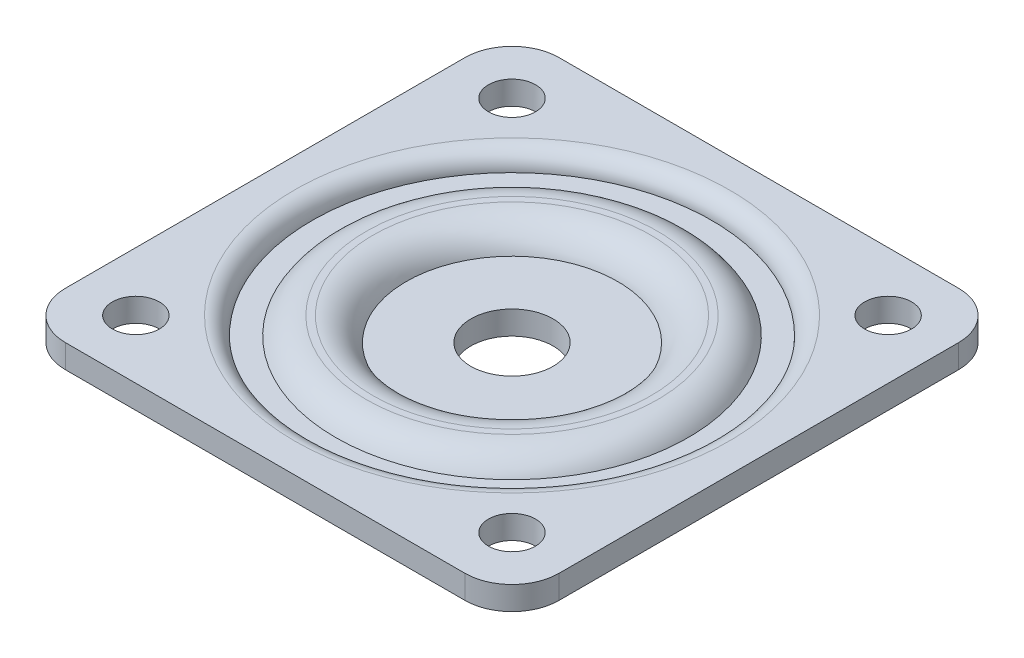
ISO-10303-21;
HEADER;
FILE_DESCRIPTION(('STEP AP214'),'2;1');
FILE_NAME('part.step','',(''),(''),'','','');
FILE_SCHEMA(('AUTOMOTIVE_DESIGN { 1 0 10303 214 1 1 1 1 }'));
ENDSEC;
DATA;
#1=APPLICATION_CONTEXT('core data for automotive mechanical design processes');
#2=APPLICATION_PROTOCOL_DEFINITION('international standard','automotive_design',2000,#1);
#3=PRODUCT_CONTEXT('',#1,'mechanical');
#4=PRODUCT('Part','Part','',(#3));
#5=PRODUCT_RELATED_PRODUCT_CATEGORY('part','',(#4));
#6=PRODUCT_DEFINITION_FORMATION('','',#4);
#7=PRODUCT_DEFINITION_CONTEXT('part definition',#1,'design');
#8=PRODUCT_DEFINITION('design','',#6,#7);
#9=PRODUCT_DEFINITION_SHAPE('','',#8);
#10=(LENGTH_UNIT() NAMED_UNIT(*) SI_UNIT(.MILLI.,.METRE.));
#11=(NAMED_UNIT(*) PLANE_ANGLE_UNIT() SI_UNIT($,.RADIAN.));
#12=(NAMED_UNIT(*) SI_UNIT($,.STERADIAN.) SOLID_ANGLE_UNIT());
#13=UNCERTAINTY_MEASURE_WITH_UNIT(LENGTH_MEASURE(1.E-05),#10,'distance_accuracy_value','');
#14=(GEOMETRIC_REPRESENTATION_CONTEXT(3) GLOBAL_UNCERTAINTY_ASSIGNED_CONTEXT((#13)) GLOBAL_UNIT_ASSIGNED_CONTEXT((#10,
#11,#12)) REPRESENTATION_CONTEXT('',''));
#15=CARTESIAN_POINT('',(0.,0.,0.));
#16=DIRECTION('',(0.,0.,1.));
#17=DIRECTION('',(1.,0.,0.));
#18=AXIS2_PLACEMENT_3D('',#15,#16,#17);
#19=CARTESIAN_POINT('',(-21.,4.,21.));
#20=DIRECTION('',(1.,0.,0.));
#21=DIRECTION('',(0.,0.,-1.));
#22=AXIS2_PLACEMENT_3D('',#19,#20,#21);
#23=PLANE('',#22);
#24=DIRECTION('',(0.,0.,1.));
#25=VECTOR('',#24,1.);
#26=CARTESIAN_POINT('',(-21.,4.,21.));
#27=LINE('',#26,#25);
#28=CARTESIAN_POINT('',(-21.,4.,-17.));
#29=VERTEX_POINT('',#28);
#30=CARTESIAN_POINT('',(-21.,4.,17.));
#31=VERTEX_POINT('',#30);
#32=EDGE_CURVE('E156',#29,#31,#27,.T.);
#33=ORIENTED_EDGE('',*,*,#32,.F.);
#34=DIRECTION('',(0.,-1.,0.));
#35=VECTOR('',#34,1.);
#36=CARTESIAN_POINT('',(-21.,4.,-17.));
#37=LINE('',#36,#35);
#38=CARTESIAN_POINT('',(-21.,2.,-17.));
#39=VERTEX_POINT('',#38);
#40=EDGE_CURVE('E109',#29,#39,#37,.T.);
#41=ORIENTED_EDGE('',*,*,#40,.T.);
#42=DIRECTION('',(0.,0.,-1.));
#43=VECTOR('',#42,1.);
#44=CARTESIAN_POINT('',(-21.,2.,0.));
#45=LINE('',#44,#43);
#46=CARTESIAN_POINT('',(-21.,2.,17.));
#47=VERTEX_POINT('',#46);
#48=EDGE_CURVE('E101',#47,#39,#45,.T.);
#49=ORIENTED_EDGE('',*,*,#48,.F.);
#50=DIRECTION('',(0.,-1.,0.));
#51=VECTOR('',#50,1.);
#52=CARTESIAN_POINT('',(-21.,4.,17.));
#53=LINE('',#52,#51);
#54=EDGE_CURVE('E114',#47,#31,#53,.F.);
#55=ORIENTED_EDGE('',*,*,#54,.T.);
#56=EDGE_LOOP('',(#33,#41,#49,#55));
#57=FACE_BOUND('',#56,.T.);
#58=ADVANCED_FACE('F32',(#57),#23,.F.);
#59=CARTESIAN_POINT('',(21.,4.,21.));
#60=DIRECTION('',(0.,0.,-1.));
#61=DIRECTION('',(-1.,0.,0.));
#62=AXIS2_PLACEMENT_3D('',#59,#60,#61);
#63=PLANE('',#62);
#64=DIRECTION('',(-1.,0.,0.));
#65=VECTOR('',#64,1.);
#66=CARTESIAN_POINT('',(0.,2.,21.));
#67=LINE('',#66,#65);
#68=CARTESIAN_POINT('',(17.,2.,21.));
#69=VERTEX_POINT('',#68);
#70=CARTESIAN_POINT('',(-17.,2.,21.));
#71=VERTEX_POINT('',#70);
#72=EDGE_CURVE('E103',#69,#71,#67,.T.);
#73=ORIENTED_EDGE('',*,*,#72,.F.);
#74=DIRECTION('',(0.,-1.,0.));
#75=VECTOR('',#74,1.);
#76=CARTESIAN_POINT('',(17.,4.,21.));
#77=LINE('',#76,#75);
#78=CARTESIAN_POINT('',(17.,4.,21.));
#79=VERTEX_POINT('',#78);
#80=EDGE_CURVE('E11',#69,#79,#77,.F.);
#81=ORIENTED_EDGE('',*,*,#80,.T.);
#82=DIRECTION('',(1.,0.,0.));
#83=VECTOR('',#82,1.);
#84=CARTESIAN_POINT('',(21.,4.,21.));
#85=LINE('',#84,#83);
#86=CARTESIAN_POINT('',(-17.,4.,21.));
#87=VERTEX_POINT('',#86);
#88=EDGE_CURVE('E154',#87,#79,#85,.T.);
#89=ORIENTED_EDGE('',*,*,#88,.F.);
#90=DIRECTION('',(0.,-1.,0.));
#91=VECTOR('',#90,1.);
#92=CARTESIAN_POINT('',(-17.,4.,21.));
#93=LINE('',#92,#91);
#94=EDGE_CURVE('E40',#87,#71,#93,.T.);
#95=ORIENTED_EDGE('',*,*,#94,.T.);
#96=EDGE_LOOP('',(#73,#81,#89,#95));
#97=FACE_BOUND('',#96,.T.);
#98=ADVANCED_FACE('F152',(#97),#63,.F.);
#99=CARTESIAN_POINT('',(21.,4.,21.));
#100=DIRECTION('',(-1.,0.,0.));
#101=DIRECTION('',(0.,0.,1.));
#102=AXIS2_PLACEMENT_3D('',#99,#100,#101);
#103=PLANE('',#102);
#104=DIRECTION('',(0.,0.,1.));
#105=VECTOR('',#104,1.);
#106=CARTESIAN_POINT('',(21.,2.,0.));
#107=LINE('',#106,#105);
#108=CARTESIAN_POINT('',(21.,2.,-17.));
#109=VERTEX_POINT('',#108);
#110=CARTESIAN_POINT('',(21.,2.,17.));
#111=VERTEX_POINT('',#110);
#112=EDGE_CURVE('E225',#109,#111,#107,.T.);
#113=ORIENTED_EDGE('',*,*,#112,.F.);
#114=DIRECTION('',(0.,-1.,0.));
#115=VECTOR('',#114,1.);
#116=CARTESIAN_POINT('',(21.,4.,-17.));
#117=LINE('',#116,#115);
#118=CARTESIAN_POINT('',(21.,4.,-17.));
#119=VERTEX_POINT('',#118);
#120=EDGE_CURVE('E47',#109,#119,#117,.F.);
#121=ORIENTED_EDGE('',*,*,#120,.T.);
#122=DIRECTION('',(0.,0.,-1.));
#123=VECTOR('',#122,1.);
#124=CARTESIAN_POINT('',(21.,4.,21.));
#125=LINE('',#124,#123);
#126=CARTESIAN_POINT('',(21.,4.,17.));
#127=VERTEX_POINT('',#126);
#128=EDGE_CURVE('E155',#127,#119,#125,.T.);
#129=ORIENTED_EDGE('',*,*,#128,.F.);
#130=DIRECTION('',(0.,-1.,0.));
#131=VECTOR('',#130,1.);
#132=CARTESIAN_POINT('',(21.,4.,17.));
#133=LINE('',#132,#131);
#134=EDGE_CURVE('E147',#127,#111,#133,.T.);
#135=ORIENTED_EDGE('',*,*,#134,.T.);
#136=EDGE_LOOP('',(#113,#121,#129,#135));
#137=FACE_BOUND('',#136,.T.);
#138=ADVANCED_FACE('F257',(#137),#103,.F.);
#139=CARTESIAN_POINT('',(21.,4.,-21.));
#140=DIRECTION('',(0.,0.,1.));
#141=DIRECTION('',(1.,0.,0.));
#142=AXIS2_PLACEMENT_3D('',#139,#140,#141);
#143=PLANE('',#142);
#144=DIRECTION('',(1.,0.,0.));
#145=VECTOR('',#144,1.);
#146=CARTESIAN_POINT('',(0.,2.,-21.));
#147=LINE('',#146,#145);
#148=CARTESIAN_POINT('',(-17.,2.,-21.));
#149=VERTEX_POINT('',#148);
#150=CARTESIAN_POINT('',(17.,2.,-21.));
#151=VERTEX_POINT('',#150);
#152=EDGE_CURVE('E117',#149,#151,#147,.T.);
#153=ORIENTED_EDGE('',*,*,#152,.F.);
#154=DIRECTION('',(0.,-1.,0.));
#155=VECTOR('',#154,1.);
#156=CARTESIAN_POINT('',(-17.,4.,-21.));
#157=LINE('',#156,#155);
#158=CARTESIAN_POINT('',(-17.,4.,-21.));
#159=VERTEX_POINT('',#158);
#160=EDGE_CURVE('E139',#149,#159,#157,.F.);
#161=ORIENTED_EDGE('',*,*,#160,.T.);
#162=DIRECTION('',(-1.,0.,0.));
#163=VECTOR('',#162,1.);
#164=CARTESIAN_POINT('',(21.,4.,-21.));
#165=LINE('',#164,#163);
#166=CARTESIAN_POINT('',(17.,4.,-21.));
#167=VERTEX_POINT('',#166);
#168=EDGE_CURVE('E158',#167,#159,#165,.T.);
#169=ORIENTED_EDGE('',*,*,#168,.F.);
#170=DIRECTION('',(0.,-1.,0.));
#171=VECTOR('',#170,1.);
#172=CARTESIAN_POINT('',(17.,4.,-21.));
#173=LINE('',#172,#171);
#174=EDGE_CURVE('E136',#167,#151,#173,.T.);
#175=ORIENTED_EDGE('',*,*,#174,.T.);
#176=EDGE_LOOP('',(#153,#161,#169,#175));
#177=FACE_BOUND('',#176,.T.);
#178=ADVANCED_FACE('F262',(#177),#143,.F.);
#179=CARTESIAN_POINT('',(0.,4.,0.));
#180=DIRECTION('',(0.,1.,0.));
#181=DIRECTION('',(0.,0.,1.));
#182=AXIS2_PLACEMENT_3D('',#179,#180,#181);
#183=PLANE('',#182);
#184=CARTESIAN_POINT('',(-16.,4.,16.));
#185=DIRECTION('',(0.,1.,0.));
#186=DIRECTION('',(0.,0.,1.));
#187=AXIS2_PLACEMENT_3D('',#184,#185,#186);
#188=CIRCLE('',#187,1.99999999999999);
#189=CARTESIAN_POINT('',(-16.,4.,18.));
#190=VERTEX_POINT('',#189);
#191=EDGE_CURVE('E196',#190,#190,#188,.T.);
#192=ORIENTED_EDGE('',*,*,#191,.F.);
#193=EDGE_LOOP('',(#192));
#194=FACE_BOUND('',#193,.T.);
#195=CARTESIAN_POINT('',(-16.,4.,-16.));
#196=DIRECTION('',(0.,1.,0.));
#197=DIRECTION('',(0.,0.,1.));
#198=AXIS2_PLACEMENT_3D('',#195,#196,#197);
#199=CIRCLE('',#198,1.99999999999999);
#200=CARTESIAN_POINT('',(-16.,4.,-14.));
#201=VERTEX_POINT('',#200);
#202=EDGE_CURVE('E186',#201,#201,#199,.T.);
#203=ORIENTED_EDGE('',*,*,#202,.F.);
#204=EDGE_LOOP('',(#203));
#205=FACE_BOUND('',#204,.T.);
#206=CARTESIAN_POINT('',(16.,4.,-16.));
#207=DIRECTION('',(0.,1.,0.));
#208=DIRECTION('',(0.,0.,1.));
#209=AXIS2_PLACEMENT_3D('',#206,#207,#208);
#210=CIRCLE('',#209,1.99999999999999);
#211=CARTESIAN_POINT('',(16.,4.,-14.));
#212=VERTEX_POINT('',#211);
#213=EDGE_CURVE('E183',#212,#212,#210,.T.);
#214=ORIENTED_EDGE('',*,*,#213,.F.);
#215=EDGE_LOOP('',(#214));
#216=FACE_BOUND('',#215,.T.);
#217=CARTESIAN_POINT('',(16.,4.,16.));
#218=DIRECTION('',(0.,1.,0.));
#219=DIRECTION('',(0.,0.,1.));
#220=AXIS2_PLACEMENT_3D('',#217,#218,#219);
#221=CIRCLE('',#220,1.99999999999999);
#222=CARTESIAN_POINT('',(16.,4.,18.));
#223=VERTEX_POINT('',#222);
#224=EDGE_CURVE('E182',#223,#223,#221,.T.);
#225=ORIENTED_EDGE('',*,*,#224,.F.);
#226=EDGE_LOOP('',(#225));
#227=FACE_BOUND('',#226,.T.);
#228=CARTESIAN_POINT('',(0.,4.,0.));
#229=DIRECTION('',(0.,1.,0.));
#230=DIRECTION('',(0.,0.,1.));
#231=AXIS2_PLACEMENT_3D('',#228,#229,#230);
#232=CIRCLE('',#231,18.5);
#233=CARTESIAN_POINT('',(0.,4.,18.5));
#234=VERTEX_POINT('',#233);
#235=EDGE_CURVE('E166',#234,#234,#232,.F.);
#236=ORIENTED_EDGE('',*,*,#235,.T.);
#237=EDGE_LOOP('',(#236));
#238=FACE_BOUND('',#237,.T.);
#239=ORIENTED_EDGE('',*,*,#168,.T.);
#240=CARTESIAN_POINT('',(-17.,4.,-17.));
#241=DIRECTION('',(0.,1.,0.));
#242=DIRECTION('',(0.,0.,1.));
#243=AXIS2_PLACEMENT_3D('',#240,#241,#242);
#244=CIRCLE('',#243,4.);
#245=EDGE_CURVE('E145',#159,#29,#244,.T.);
#246=ORIENTED_EDGE('',*,*,#245,.T.);
#247=ORIENTED_EDGE('',*,*,#32,.T.);
#248=CARTESIAN_POINT('',(-17.,4.,17.));
#249=DIRECTION('',(0.,1.,0.));
#250=DIRECTION('',(0.,0.,1.));
#251=AXIS2_PLACEMENT_3D('',#248,#249,#250);
#252=CIRCLE('',#251,4.);
#253=EDGE_CURVE('E120',#31,#87,#252,.T.);
#254=ORIENTED_EDGE('',*,*,#253,.T.);
#255=ORIENTED_EDGE('',*,*,#88,.T.);
#256=CARTESIAN_POINT('',(17.,4.,17.));
#257=DIRECTION('',(0.,1.,0.));
#258=DIRECTION('',(0.,0.,1.));
#259=AXIS2_PLACEMENT_3D('',#256,#257,#258);
#260=CIRCLE('',#259,4.);
#261=EDGE_CURVE('E54',#79,#127,#260,.T.);
#262=ORIENTED_EDGE('',*,*,#261,.T.);
#263=ORIENTED_EDGE('',*,*,#128,.T.);
#264=CARTESIAN_POINT('',(17.,4.,-17.));
#265=DIRECTION('',(0.,1.,0.));
#266=DIRECTION('',(0.,0.,1.));
#267=AXIS2_PLACEMENT_3D('',#264,#265,#266);
#268=CIRCLE('',#267,4.);
#269=EDGE_CURVE('E143',#119,#167,#268,.T.);
#270=ORIENTED_EDGE('',*,*,#269,.T.);
#271=EDGE_LOOP('',(#239,#246,#247,#254,#255,#262,#263,#270));
#272=FACE_BOUND('',#271,.T.);
#273=ADVANCED_FACE('F249',(#194,#205,#216,#227,#238,#272),#183,.T.);
#274=CARTESIAN_POINT('',(0.,2.5,0.));
#275=DIRECTION('',(0.,1.,0.));
#276=DIRECTION('',(0.,0.,1.));
#277=AXIS2_PLACEMENT_3D('',#274,#275,#276);
#278=PLANE('',#277);
#279=CARTESIAN_POINT('',(0.,2.5,0.));
#280=DIRECTION('',(0.,1.,0.));
#281=DIRECTION('',(0.,0.,1.));
#282=AXIS2_PLACEMENT_3D('',#279,#280,#281);
#283=CIRCLE('',#282,15.);
#284=CARTESIAN_POINT('',(0.,2.5,15.));
#285=VERTEX_POINT('',#284);
#286=EDGE_CURVE('E228',#285,#285,#283,.T.);
#287=ORIENTED_EDGE('',*,*,#286,.F.);
#288=EDGE_LOOP('',(#287));
#289=FACE_BOUND('',#288,.T.);
#290=CARTESIAN_POINT('',(0.,2.5,0.));
#291=DIRECTION('',(0.,1.,0.));
#292=DIRECTION('',(0.,0.,1.));
#293=AXIS2_PLACEMENT_3D('',#290,#291,#292);
#294=CIRCLE('',#293,17.);
#295=CARTESIAN_POINT('',(0.,2.5,17.));
#296=VERTEX_POINT('',#295);
#297=EDGE_CURVE('E160',#296,#296,#294,.T.);
#298=ORIENTED_EDGE('',*,*,#297,.T.);
#299=EDGE_LOOP('',(#298));
#300=FACE_BOUND('',#299,.T.);
#301=ADVANCED_FACE('F233',(#289,#300),#278,.T.);
#302=CARTESIAN_POINT('',(0.,4.,0.));
#303=DIRECTION('',(0.,1.,0.));
#304=DIRECTION('',(0.,0.,1.));
#305=AXIS2_PLACEMENT_3D('',#302,#303,#304);
#306=CIRCLE('',#305,11.8284271247462);
#307=CARTESIAN_POINT('',(0.,4.,11.8284271247462));
#308=VERTEX_POINT('',#307);
#309=EDGE_CURVE('E175',#308,#308,#306,.F.);
#310=ORIENTED_EDGE('',*,*,#309,.T.);
#311=EDGE_LOOP('',(#310));
#312=FACE_BOUND('',#311,.T.);
#313=CARTESIAN_POINT('',(0.,4.,0.));
#314=DIRECTION('',(0.,1.,0.));
#315=DIRECTION('',(0.,0.,1.));
#316=AXIS2_PLACEMENT_3D('',#313,#314,#315);
#317=CIRCLE('',#316,12.4019237886467);
#318=CARTESIAN_POINT('',(0.,4.,12.4019237886467));
#319=VERTEX_POINT('',#318);
#320=EDGE_CURVE('E172',#319,#319,#317,.T.);
#321=ORIENTED_EDGE('',*,*,#320,.T.);
#322=EDGE_LOOP('',(#321));
#323=FACE_BOUND('',#322,.T.);
#324=ADVANCED_FACE('F237',(#312,#323),#183,.T.);
#325=CARTESIAN_POINT('',(0.,2.5,0.));
#326=DIRECTION('',(0.,1.,0.));
#327=DIRECTION('',(0.,0.,1.));
#328=AXIS2_PLACEMENT_3D('',#325,#326,#327);
#329=TOROIDAL_SURFACE('',#328,18.5,1.5);
#330=ORIENTED_EDGE('',*,*,#235,.F.);
#331=EDGE_LOOP('',(#330));
#332=FACE_BOUND('',#331,.T.);
#333=ORIENTED_EDGE('',*,*,#297,.F.);
#334=EDGE_LOOP('',(#333));
#335=FACE_BOUND('',#334,.T.);
#336=ADVANCED_FACE('F235',(#332,#335),#329,.T.);
#337=CARTESIAN_POINT('',(0.,2.,0.));
#338=DIRECTION('',(0.,-1.,0.));
#339=DIRECTION('',(0.,0.,-1.));
#340=AXIS2_PLACEMENT_3D('',#337,#338,#339);
#341=PLANE('',#340);
#342=CARTESIAN_POINT('',(-16.,2.,16.));
#343=DIRECTION('',(0.,-1.,0.));
#344=DIRECTION('',(0.,0.,-1.));
#345=AXIS2_PLACEMENT_3D('',#342,#343,#344);
#346=CIRCLE('',#345,1.99999999999999);
#347=CARTESIAN_POINT('',(-16.,2.,14.));
#348=VERTEX_POINT('',#347);
#349=EDGE_CURVE('E128',#348,#348,#346,.T.);
#350=ORIENTED_EDGE('',*,*,#349,.F.);
#351=EDGE_LOOP('',(#350));
#352=FACE_BOUND('',#351,.T.);
#353=CARTESIAN_POINT('',(-16.,2.,-16.));
#354=DIRECTION('',(0.,-1.,0.));
#355=DIRECTION('',(0.,0.,-1.));
#356=AXIS2_PLACEMENT_3D('',#353,#354,#355);
#357=CIRCLE('',#356,1.99999999999999);
#358=CARTESIAN_POINT('',(-16.,2.,-18.));
#359=VERTEX_POINT('',#358);
#360=EDGE_CURVE('E184',#359,#359,#357,.T.);
#361=ORIENTED_EDGE('',*,*,#360,.F.);
#362=EDGE_LOOP('',(#361));
#363=FACE_BOUND('',#362,.T.);
#364=CARTESIAN_POINT('',(16.,2.,-16.));
#365=DIRECTION('',(0.,-1.,0.));
#366=DIRECTION('',(0.,0.,-1.));
#367=AXIS2_PLACEMENT_3D('',#364,#365,#366);
#368=CIRCLE('',#367,1.99999999999999);
#369=CARTESIAN_POINT('',(16.,2.,-18.));
#370=VERTEX_POINT('',#369);
#371=EDGE_CURVE('E180',#370,#370,#368,.T.);
#372=ORIENTED_EDGE('',*,*,#371,.F.);
#373=EDGE_LOOP('',(#372));
#374=FACE_BOUND('',#373,.T.);
#375=CARTESIAN_POINT('',(16.,2.,16.));
#376=DIRECTION('',(0.,-1.,0.));
#377=DIRECTION('',(0.,0.,-1.));
#378=AXIS2_PLACEMENT_3D('',#375,#376,#377);
#379=CIRCLE('',#378,1.99999999999999);
#380=CARTESIAN_POINT('',(16.,2.,14.));
#381=VERTEX_POINT('',#380);
#382=EDGE_CURVE('E201',#381,#381,#379,.T.);
#383=ORIENTED_EDGE('',*,*,#382,.F.);
#384=EDGE_LOOP('',(#383));
#385=FACE_BOUND('',#384,.T.);
#386=CARTESIAN_POINT('',(0.,2.,0.));
#387=DIRECTION('',(0.,-1.,0.));
#388=DIRECTION('',(0.,0.,-1.));
#389=AXIS2_PLACEMENT_3D('',#386,#387,#388);
#390=CIRCLE('',#389,17.);
#391=CARTESIAN_POINT('',(0.,2.,-17.));
#392=VERTEX_POINT('',#391);
#393=EDGE_CURVE('E219',#392,#392,#390,.T.);
#394=ORIENTED_EDGE('',*,*,#393,.F.);
#395=EDGE_LOOP('',(#394));
#396=FACE_BOUND('',#395,.T.);
#397=ORIENTED_EDGE('',*,*,#48,.T.);
#398=CARTESIAN_POINT('',(-17.,2.,-17.));
#399=DIRECTION('',(0.,-1.,0.));
#400=DIRECTION('',(0.,0.,-1.));
#401=AXIS2_PLACEMENT_3D('',#398,#399,#400);
#402=CIRCLE('',#401,4.);
#403=EDGE_CURVE('E134',#39,#149,#402,.T.);
#404=ORIENTED_EDGE('',*,*,#403,.T.);
#405=ORIENTED_EDGE('',*,*,#152,.T.);
#406=CARTESIAN_POINT('',(17.,2.,-17.));
#407=DIRECTION('',(0.,-1.,0.));
#408=DIRECTION('',(0.,0.,-1.));
#409=AXIS2_PLACEMENT_3D('',#406,#407,#408);
#410=CIRCLE('',#409,4.);
#411=EDGE_CURVE('E132',#151,#109,#410,.T.);
#412=ORIENTED_EDGE('',*,*,#411,.T.);
#413=ORIENTED_EDGE('',*,*,#112,.T.);
#414=CARTESIAN_POINT('',(17.,2.,17.));
#415=DIRECTION('',(0.,-1.,0.));
#416=DIRECTION('',(0.,0.,-1.));
#417=AXIS2_PLACEMENT_3D('',#414,#415,#416);
#418=CIRCLE('',#417,4.);
#419=EDGE_CURVE('E108',#111,#69,#418,.T.);
#420=ORIENTED_EDGE('',*,*,#419,.T.);
#421=ORIENTED_EDGE('',*,*,#72,.T.);
#422=CARTESIAN_POINT('',(-17.,2.,17.));
#423=DIRECTION('',(0.,-1.,0.));
#424=DIRECTION('',(0.,0.,-1.));
#425=AXIS2_PLACEMENT_3D('',#422,#423,#424);
#426=CIRCLE('',#425,4.);
#427=EDGE_CURVE('E98',#71,#47,#426,.T.);
#428=ORIENTED_EDGE('',*,*,#427,.T.);
#429=EDGE_LOOP('',(#397,#404,#405,#412,#413,#420,#421,#428));
#430=FACE_BOUND('',#429,.T.);
#431=ADVANCED_FACE('F100',(#352,#363,#374,#385,#396,#430),#341,.T.);
#432=CARTESIAN_POINT('',(0.,2.,0.));
#433=DIRECTION('',(0.,1.,0.));
#434=DIRECTION('',(0.,0.,1.));
#435=AXIS2_PLACEMENT_3D('',#432,#433,#434);
#436=TOROIDAL_SURFACE('',#435,15.,2.);
#437=ORIENTED_EDGE('',*,*,#393,.T.);
#438=EDGE_LOOP('',(#437));
#439=FACE_BOUND('',#438,.T.);
#440=CARTESIAN_POINT('',(0.,0.,0.));
#441=DIRECTION('',(0.,1.,0.));
#442=DIRECTION('',(0.,0.,1.));
#443=AXIS2_PLACEMENT_3D('',#440,#441,#442);
#444=CIRCLE('',#443,15.);
#445=CARTESIAN_POINT('',(0.,0.,15.));
#446=VERTEX_POINT('',#445);
#447=EDGE_CURVE('E169',#446,#446,#444,.F.);
#448=ORIENTED_EDGE('',*,*,#447,.F.);
#449=EDGE_LOOP('',(#448));
#450=FACE_BOUND('',#449,.T.);
#451=ADVANCED_FACE('F244',(#439,#450),#436,.T.);
#452=CARTESIAN_POINT('',(0.,2.,0.));
#453=DIRECTION('',(0.,1.,0.));
#454=DIRECTION('',(0.,0.,1.));
#455=AXIS2_PLACEMENT_3D('',#452,#453,#454);
#456=PLANE('',#455);
#457=CARTESIAN_POINT('',(0.,2.,0.));
#458=DIRECTION('',(0.,1.,0.));
#459=DIRECTION('',(0.,0.,1.));
#460=AXIS2_PLACEMENT_3D('',#457,#458,#459);
#461=CIRCLE('',#460,3.5);
#462=CARTESIAN_POINT('',(0.,2.,3.5));
#463=VERTEX_POINT('',#462);
#464=EDGE_CURVE('E204',#463,#463,#461,.T.);
#465=ORIENTED_EDGE('',*,*,#464,.F.);
#466=EDGE_LOOP('',(#465));
#467=FACE_BOUND('',#466,.T.);
#468=CARTESIAN_POINT('',(0.,2.,0.));
#469=DIRECTION('',(0.,1.,0.));
#470=DIRECTION('',(0.,0.,1.));
#471=AXIS2_PLACEMENT_3D('',#468,#469,#470);
#472=CIRCLE('',#471,9.);
#473=CARTESIAN_POINT('',(0.,2.,9.));
#474=VERTEX_POINT('',#473);
#475=EDGE_CURVE('E216',#474,#474,#472,.T.);
#476=ORIENTED_EDGE('',*,*,#475,.T.);
#477=EDGE_LOOP('',(#476));
#478=FACE_BOUND('',#477,.T.);
#479=ADVANCED_FACE('F277',(#467,#478),#456,.T.);
#480=CARTESIAN_POINT('',(0.,1.,0.));
#481=DIRECTION('',(0.,1.,0.));
#482=DIRECTION('',(0.,0.,1.));
#483=AXIS2_PLACEMENT_3D('',#480,#481,#482);
#484=TOROIDAL_SURFACE('',#483,11.8284271247462,3.);
#485=ORIENTED_EDGE('',*,*,#309,.F.);
#486=EDGE_LOOP('',(#485));
#487=FACE_BOUND('',#486,.T.);
#488=ORIENTED_EDGE('',*,*,#475,.F.);
#489=EDGE_LOOP('',(#488));
#490=FACE_BOUND('',#489,.T.);
#491=ADVANCED_FACE('F280',(#487,#490),#484,.T.);
#492=CARTESIAN_POINT('',(0.,1.,0.));
#493=DIRECTION('',(0.,-1.,0.));
#494=DIRECTION('',(0.,0.,-1.));
#495=AXIS2_PLACEMENT_3D('',#492,#493,#494);
#496=TOROIDAL_SURFACE('',#495,12.4019237886467,3.);
#497=ORIENTED_EDGE('',*,*,#286,.T.);
#498=EDGE_LOOP('',(#497));
#499=FACE_BOUND('',#498,.T.);
#500=ORIENTED_EDGE('',*,*,#320,.F.);
#501=EDGE_LOOP('',(#500));
#502=FACE_BOUND('',#501,.T.);
#503=ADVANCED_FACE('F285',(#499,#502),#496,.T.);
#504=CARTESIAN_POINT('',(0.,2.,0.));
#505=DIRECTION('',(0.,-1.,0.));
#506=DIRECTION('',(0.,0.,-1.));
#507=AXIS2_PLACEMENT_3D('',#504,#505,#506);
#508=CYLINDRICAL_SURFACE('',#507,14.);
#509=CARTESIAN_POINT('',(0.,1.73205080756888,0.));
#510=DIRECTION('',(0.,-1.,0.));
#511=DIRECTION('',(0.,0.,-1.));
#512=AXIS2_PLACEMENT_3D('',#509,#510,#511);
#513=CIRCLE('',#512,14.);
#514=CARTESIAN_POINT('',(0.,1.73205080756888,-14.));
#515=VERTEX_POINT('',#514);
#516=EDGE_CURVE('E121',#515,#515,#513,.T.);
#517=ORIENTED_EDGE('',*,*,#516,.T.);
#518=EDGE_LOOP('',(#517));
#519=FACE_BOUND('',#518,.T.);
#520=CARTESIAN_POINT('',(0.,2.,0.));
#521=DIRECTION('',(0.,-1.,0.));
#522=DIRECTION('',(0.,0.,-1.));
#523=AXIS2_PLACEMENT_3D('',#520,#521,#522);
#524=CIRCLE('',#523,14.);
#525=CARTESIAN_POINT('',(0.,2.,-14.));
#526=VERTEX_POINT('',#525);
#527=EDGE_CURVE('E213',#526,#526,#524,.T.);
#528=ORIENTED_EDGE('',*,*,#527,.F.);
#529=EDGE_LOOP('',(#528));
#530=FACE_BOUND('',#529,.T.);
#531=ADVANCED_FACE('F282',(#519,#530),#508,.F.);
#532=CARTESIAN_POINT('',(0.,2.,0.));
#533=DIRECTION('',(0.,-1.,0.));
#534=DIRECTION('',(0.,0.,-1.));
#535=AXIS2_PLACEMENT_3D('',#532,#533,#534);
#536=PLANE('',#535);
#537=CARTESIAN_POINT('',(0.,2.,0.));
#538=DIRECTION('',(0.,-1.,0.));
#539=DIRECTION('',(0.,0.,-1.));
#540=AXIS2_PLACEMENT_3D('',#537,#538,#539);
#541=CIRCLE('',#540,12.);
#542=CARTESIAN_POINT('',(0.,2.,-12.));
#543=VERTEX_POINT('',#542);
#544=EDGE_CURVE('E208',#543,#543,#541,.T.);
#545=ORIENTED_EDGE('',*,*,#544,.F.);
#546=EDGE_LOOP('',(#545));
#547=FACE_BOUND('',#546,.T.);
#548=ORIENTED_EDGE('',*,*,#527,.T.);
#549=EDGE_LOOP('',(#548));
#550=FACE_BOUND('',#549,.T.);
#551=ADVANCED_FACE('F269',(#547,#550),#536,.T.);
#552=CARTESIAN_POINT('',(0.,0.,0.));
#553=DIRECTION('',(0.,1.,0.));
#554=DIRECTION('',(0.,0.,1.));
#555=AXIS2_PLACEMENT_3D('',#552,#553,#554);
#556=PLANE('',#555);
#557=CARTESIAN_POINT('',(0.,0.,0.));
#558=DIRECTION('',(0.,1.,0.));
#559=DIRECTION('',(0.,0.,1.));
#560=AXIS2_PLACEMENT_3D('',#557,#558,#559);
#561=CIRCLE('',#560,3.5);
#562=CARTESIAN_POINT('',(0.,0.,3.5));
#563=VERTEX_POINT('',#562);
#564=EDGE_CURVE('E205',#563,#563,#561,.T.);
#565=ORIENTED_EDGE('',*,*,#564,.T.);
#566=EDGE_LOOP('',(#565));
#567=FACE_BOUND('',#566,.T.);
#568=CARTESIAN_POINT('',(0.,0.,0.));
#569=DIRECTION('',(0.,1.,0.));
#570=DIRECTION('',(0.,0.,1.));
#571=AXIS2_PLACEMENT_3D('',#568,#569,#570);
#572=CIRCLE('',#571,10.);
#573=CARTESIAN_POINT('',(0.,0.,10.));
#574=VERTEX_POINT('',#573);
#575=EDGE_CURVE('E125',#574,#574,#572,.F.);
#576=ORIENTED_EDGE('',*,*,#575,.T.);
#577=EDGE_LOOP('',(#576));
#578=FACE_BOUND('',#577,.T.);
#579=ADVANCED_FACE('F266',(#567,#578),#556,.F.);
#580=CARTESIAN_POINT('',(0.,2.,0.));
#581=DIRECTION('',(0.,1.,0.));
#582=DIRECTION('',(0.,0.,1.));
#583=AXIS2_PLACEMENT_3D('',#580,#581,#582);
#584=TOROIDAL_SURFACE('',#583,10.,2.);
#585=ORIENTED_EDGE('',*,*,#544,.T.);
#586=EDGE_LOOP('',(#585));
#587=FACE_BOUND('',#586,.T.);
#588=ORIENTED_EDGE('',*,*,#575,.F.);
#589=EDGE_LOOP('',(#588));
#590=FACE_BOUND('',#589,.T.);
#591=ADVANCED_FACE('F268',(#587,#590),#584,.T.);
#592=CARTESIAN_POINT('',(0.,1.73205080756888,0.));
#593=DIRECTION('',(0.,-1.,0.));
#594=DIRECTION('',(0.,0.,-1.));
#595=AXIS2_PLACEMENT_3D('',#592,#593,#594);
#596=TOROIDAL_SURFACE('',#595,16.,2.);
#597=ORIENTED_EDGE('',*,*,#447,.T.);
#598=EDGE_LOOP('',(#597));
#599=FACE_BOUND('',#598,.T.);
#600=ORIENTED_EDGE('',*,*,#516,.F.);
#601=EDGE_LOOP('',(#600));
#602=FACE_BOUND('',#601,.T.);
#603=ADVANCED_FACE('F294',(#599,#602),#596,.T.);
#604=CARTESIAN_POINT('',(0.,0.,0.));
#605=DIRECTION('',(0.,1.,0.));
#606=DIRECTION('',(0.,0.,1.));
#607=AXIS2_PLACEMENT_3D('',#604,#605,#606);
#608=CYLINDRICAL_SURFACE('',#607,3.5);
#609=ORIENTED_EDGE('',*,*,#564,.F.);
#610=EDGE_LOOP('',(#609));
#611=FACE_BOUND('',#610,.T.);
#612=ORIENTED_EDGE('',*,*,#464,.T.);
#613=EDGE_LOOP('',(#612));
#614=FACE_BOUND('',#613,.T.);
#615=ADVANCED_FACE('F290',(#611,#614),#608,.F.);
#616=CARTESIAN_POINT('',(16.,4.,16.));
#617=DIRECTION('',(0.,1.,0.));
#618=DIRECTION('',(0.,0.,1.));
#619=AXIS2_PLACEMENT_3D('',#616,#617,#618);
#620=CYLINDRICAL_SURFACE('',#619,1.99999999999999);
#621=ORIENTED_EDGE('',*,*,#382,.T.);
#622=EDGE_LOOP('',(#621));
#623=FACE_BOUND('',#622,.T.);
#624=ORIENTED_EDGE('',*,*,#224,.T.);
#625=EDGE_LOOP('',(#624));
#626=FACE_BOUND('',#625,.T.);
#627=ADVANCED_FACE('F293',(#623,#626),#620,.F.);
#628=CARTESIAN_POINT('',(16.,4.,-16.));
#629=DIRECTION('',(0.,1.,0.));
#630=DIRECTION('',(0.,0.,1.));
#631=AXIS2_PLACEMENT_3D('',#628,#629,#630);
#632=CYLINDRICAL_SURFACE('',#631,1.99999999999999);
#633=ORIENTED_EDGE('',*,*,#371,.T.);
#634=EDGE_LOOP('',(#633));
#635=FACE_BOUND('',#634,.T.);
#636=ORIENTED_EDGE('',*,*,#213,.T.);
#637=EDGE_LOOP('',(#636));
#638=FACE_BOUND('',#637,.T.);
#639=ADVANCED_FACE('F298',(#635,#638),#632,.F.);
#640=CARTESIAN_POINT('',(-16.,4.,-16.));
#641=DIRECTION('',(0.,1.,0.));
#642=DIRECTION('',(0.,0.,1.));
#643=AXIS2_PLACEMENT_3D('',#640,#641,#642);
#644=CYLINDRICAL_SURFACE('',#643,1.99999999999999);
#645=ORIENTED_EDGE('',*,*,#360,.T.);
#646=EDGE_LOOP('',(#645));
#647=FACE_BOUND('',#646,.T.);
#648=ORIENTED_EDGE('',*,*,#202,.T.);
#649=EDGE_LOOP('',(#648));
#650=FACE_BOUND('',#649,.T.);
#651=ADVANCED_FACE('F302',(#647,#650),#644,.F.);
#652=CARTESIAN_POINT('',(-16.,4.,16.));
#653=DIRECTION('',(0.,1.,0.));
#654=DIRECTION('',(0.,0.,1.));
#655=AXIS2_PLACEMENT_3D('',#652,#653,#654);
#656=CYLINDRICAL_SURFACE('',#655,1.99999999999999);
#657=ORIENTED_EDGE('',*,*,#349,.T.);
#658=EDGE_LOOP('',(#657));
#659=FACE_BOUND('',#658,.T.);
#660=ORIENTED_EDGE('',*,*,#191,.T.);
#661=EDGE_LOOP('',(#660));
#662=FACE_BOUND('',#661,.T.);
#663=ADVANCED_FACE('F306',(#659,#662),#656,.F.);
#664=CARTESIAN_POINT('',(-17.,4.,-17.));
#665=DIRECTION('',(0.,-1.,0.));
#666=DIRECTION('',(0.,0.,-1.));
#667=AXIS2_PLACEMENT_3D('',#664,#665,#666);
#668=CYLINDRICAL_SURFACE('',#667,4.);
#669=ORIENTED_EDGE('',*,*,#245,.F.);
#670=ORIENTED_EDGE('',*,*,#160,.F.);
#671=ORIENTED_EDGE('',*,*,#403,.F.);
#672=ORIENTED_EDGE('',*,*,#40,.F.);
#673=EDGE_LOOP('',(#669,#670,#671,#672));
#674=FACE_BOUND('',#673,.T.);
#675=ADVANCED_FACE('F308',(#674),#668,.T.);
#676=CARTESIAN_POINT('',(17.,4.,-17.));
#677=DIRECTION('',(0.,-1.,0.));
#678=DIRECTION('',(0.,0.,-1.));
#679=AXIS2_PLACEMENT_3D('',#676,#677,#678);
#680=CYLINDRICAL_SURFACE('',#679,4.);
#681=ORIENTED_EDGE('',*,*,#269,.F.);
#682=ORIENTED_EDGE('',*,*,#120,.F.);
#683=ORIENTED_EDGE('',*,*,#411,.F.);
#684=ORIENTED_EDGE('',*,*,#174,.F.);
#685=EDGE_LOOP('',(#681,#682,#683,#684));
#686=FACE_BOUND('',#685,.T.);
#687=ADVANCED_FACE('F313',(#686),#680,.T.);
#688=CARTESIAN_POINT('',(17.,4.,17.));
#689=DIRECTION('',(0.,-1.,0.));
#690=DIRECTION('',(0.,0.,-1.));
#691=AXIS2_PLACEMENT_3D('',#688,#689,#690);
#692=CYLINDRICAL_SURFACE('',#691,4.);
#693=ORIENTED_EDGE('',*,*,#261,.F.);
#694=ORIENTED_EDGE('',*,*,#80,.F.);
#695=ORIENTED_EDGE('',*,*,#419,.F.);
#696=ORIENTED_EDGE('',*,*,#134,.F.);
#697=EDGE_LOOP('',(#693,#694,#695,#696));
#698=FACE_BOUND('',#697,.T.);
#699=ADVANCED_FACE('F335',(#698),#692,.T.);
#700=CARTESIAN_POINT('',(-17.,4.,17.));
#701=DIRECTION('',(0.,-1.,0.));
#702=DIRECTION('',(0.,0.,-1.));
#703=AXIS2_PLACEMENT_3D('',#700,#701,#702);
#704=CYLINDRICAL_SURFACE('',#703,4.);
#705=ORIENTED_EDGE('',*,*,#253,.F.);
#706=ORIENTED_EDGE('',*,*,#54,.F.);
#707=ORIENTED_EDGE('',*,*,#427,.F.);
#708=ORIENTED_EDGE('',*,*,#94,.F.);
#709=EDGE_LOOP('',(#705,#706,#707,#708));
#710=FACE_BOUND('',#709,.T.);
#711=ADVANCED_FACE('F34',(#710),#704,.T.);
#712=CLOSED_SHELL('',(#58,#98,#138,#178,#273,#301,#324,#336,#431,#451,#479,#491,#503,#531,#551,
#579,#591,#603,#615,#627,#639,#651,#663,#675,#687,#699,#711));
#713=MANIFOLD_SOLID_BREP('B2',#712);
#714=ADVANCED_BREP_SHAPE_REPRESENTATION('',(#18,#713),#14);
#715=SHAPE_DEFINITION_REPRESENTATION(#9,#714);
ENDSEC;
END-ISO-10303-21;
